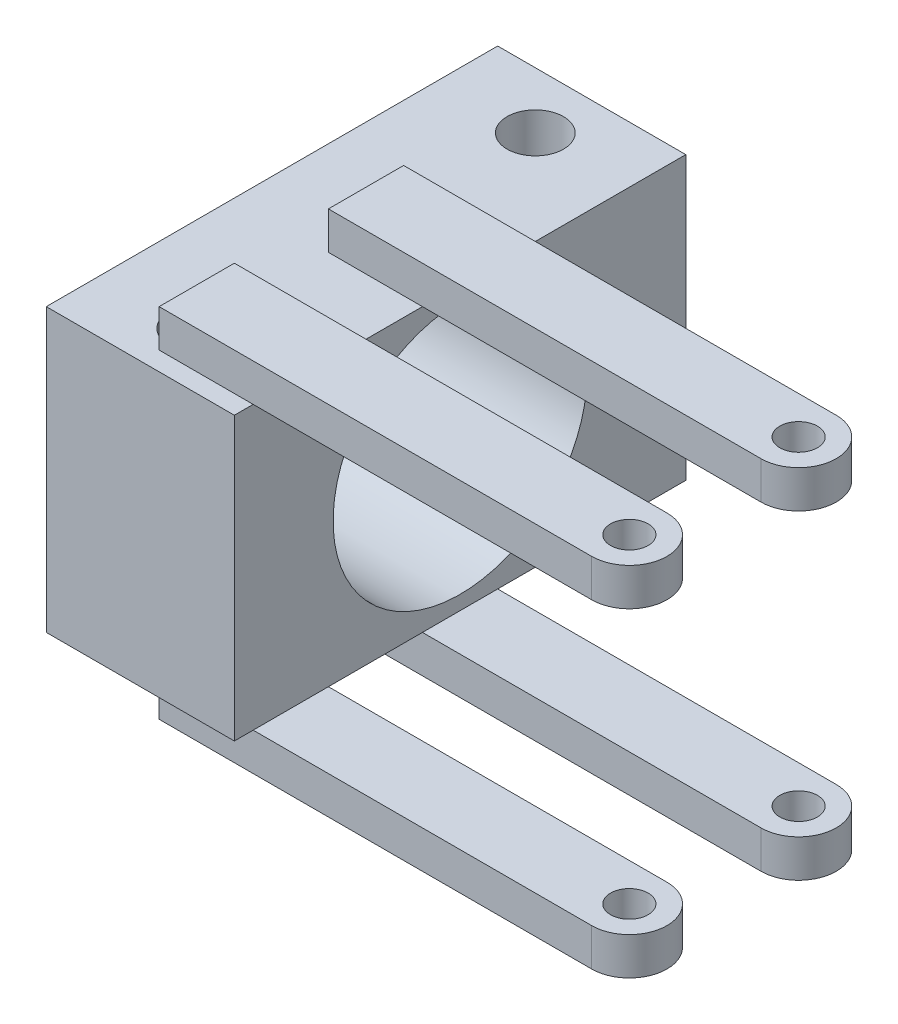
ISO-10303-21;
HEADER;
FILE_DESCRIPTION(('STEP AP214'),'2;1');
FILE_NAME('part.step','',(''),(''),'','','');
FILE_SCHEMA(('AUTOMOTIVE_DESIGN { 1 0 10303 214 1 1 1 1 }'));
ENDSEC;
DATA;
#1=APPLICATION_CONTEXT('core data for automotive mechanical design processes');
#2=APPLICATION_PROTOCOL_DEFINITION('international standard','automotive_design',2000,#1);
#3=PRODUCT_CONTEXT('',#1,'mechanical');
#4=PRODUCT('Part','Part','',(#3));
#5=PRODUCT_RELATED_PRODUCT_CATEGORY('part','',(#4));
#6=PRODUCT_DEFINITION_FORMATION('','',#4);
#7=PRODUCT_DEFINITION_CONTEXT('part definition',#1,'design');
#8=PRODUCT_DEFINITION('design','',#6,#7);
#9=PRODUCT_DEFINITION_SHAPE('','',#8);
#10=(LENGTH_UNIT() NAMED_UNIT(*) SI_UNIT(.MILLI.,.METRE.));
#11=(NAMED_UNIT(*) PLANE_ANGLE_UNIT() SI_UNIT($,.RADIAN.));
#12=(NAMED_UNIT(*) SI_UNIT($,.STERADIAN.) SOLID_ANGLE_UNIT());
#13=UNCERTAINTY_MEASURE_WITH_UNIT(LENGTH_MEASURE(1.E-05),#10,'distance_accuracy_value','');
#14=(GEOMETRIC_REPRESENTATION_CONTEXT(3) GLOBAL_UNCERTAINTY_ASSIGNED_CONTEXT((#13)) GLOBAL_UNIT_ASSIGNED_CONTEXT((#10,
#11,#12)) REPRESENTATION_CONTEXT('',''));
#15=CARTESIAN_POINT('',(0.,0.,0.));
#16=DIRECTION('',(0.,0.,1.));
#17=DIRECTION('',(1.,0.,0.));
#18=AXIS2_PLACEMENT_3D('',#15,#16,#17);
#19=CARTESIAN_POINT('',(0.,15.,0.));
#20=DIRECTION('',(0.,-1.,0.));
#21=DIRECTION('',(0.,0.,-1.));
#22=AXIS2_PLACEMENT_3D('',#19,#20,#21);
#23=PLANE('',#22);
#24=CARTESIAN_POINT('',(0.,15.,-9.));
#25=DIRECTION('',(0.,1.,0.));
#26=DIRECTION('',(0.,0.,1.));
#27=AXIS2_PLACEMENT_3D('',#24,#25,#26);
#28=CIRCLE('',#27,1.5);
#29=CARTESIAN_POINT('',(0.,15.,-7.5));
#30=VERTEX_POINT('',#29);
#31=EDGE_CURVE('E394',#30,#30,#28,.T.);
#32=ORIENTED_EDGE('',*,*,#31,.F.);
#33=EDGE_LOOP('',(#32));
#34=FACE_BOUND('',#33,.T.);
#35=DIRECTION('',(-1.,0.,0.));
#36=VECTOR('',#35,1.);
#37=CARTESIAN_POINT('',(0.,15.,7.));
#38=LINE('',#37,#36);
#39=CARTESIAN_POINT('',(5.,15.,7.));
#40=VERTEX_POINT('',#39);
#41=CARTESIAN_POINT('',(0.,15.,7.));
#42=VERTEX_POINT('',#41);
#43=EDGE_CURVE('E477',#40,#42,#38,.T.);
#44=ORIENTED_EDGE('',*,*,#43,.F.);
#45=DIRECTION('',(0.,0.,-1.));
#46=VECTOR('',#45,1.);
#47=CARTESIAN_POINT('',(5.,15.,12.));
#48=LINE('',#47,#46);
#49=CARTESIAN_POINT('',(5.,15.,2.));
#50=VERTEX_POINT('',#49);
#51=EDGE_CURVE('E404',#40,#50,#48,.T.);
#52=ORIENTED_EDGE('',*,*,#51,.T.);
#53=DIRECTION('',(-1.,0.,0.));
#54=VECTOR('',#53,1.);
#55=CARTESIAN_POINT('',(0.,15.,2.));
#56=LINE('',#55,#54);
#57=CARTESIAN_POINT('',(0.,15.,2.));
#58=VERTEX_POINT('',#57);
#59=EDGE_CURVE('E11',#50,#58,#56,.T.);
#60=ORIENTED_EDGE('',*,*,#59,.T.);
#61=DIRECTION('',(0.,0.,-1.));
#62=VECTOR('',#61,1.);
#63=CARTESIAN_POINT('',(0.,15.,0.));
#64=LINE('',#63,#62);
#65=CARTESIAN_POINT('',(0.,15.,-2.));
#66=VERTEX_POINT('',#65);
#67=EDGE_CURVE('E304',#58,#66,#64,.T.);
#68=ORIENTED_EDGE('',*,*,#67,.T.);
#69=DIRECTION('',(1.,0.,0.));
#70=VECTOR('',#69,1.);
#71=CARTESIAN_POINT('',(23.,15.,-2.));
#72=LINE('',#71,#70);
#73=CARTESIAN_POINT('',(5.,15.,-2.));
#74=VERTEX_POINT('',#73);
#75=EDGE_CURVE('E311',#66,#74,#72,.T.);
#76=ORIENTED_EDGE('',*,*,#75,.T.);
#77=CARTESIAN_POINT('',(5.,15.,-12.));
#78=VERTEX_POINT('',#77);
#79=EDGE_CURVE('E423',#74,#78,#48,.T.);
#80=ORIENTED_EDGE('',*,*,#79,.T.);
#81=DIRECTION('',(-1.,0.,0.));
#82=VECTOR('',#81,1.);
#83=CARTESIAN_POINT('',(-5.,15.,-12.));
#84=LINE('',#83,#82);
#85=CARTESIAN_POINT('',(-5.,15.,-12.));
#86=VERTEX_POINT('',#85);
#87=EDGE_CURVE('E403',#78,#86,#84,.T.);
#88=ORIENTED_EDGE('',*,*,#87,.T.);
#89=DIRECTION('',(0.,0.,1.));
#90=VECTOR('',#89,1.);
#91=CARTESIAN_POINT('',(-5.,15.,12.));
#92=LINE('',#91,#90);
#93=CARTESIAN_POINT('',(-5.,15.,12.));
#94=VERTEX_POINT('',#93);
#95=EDGE_CURVE('E407',#86,#94,#92,.T.);
#96=ORIENTED_EDGE('',*,*,#95,.T.);
#97=DIRECTION('',(1.,0.,0.));
#98=VECTOR('',#97,1.);
#99=CARTESIAN_POINT('',(-5.,15.,12.));
#100=LINE('',#99,#98);
#101=CARTESIAN_POINT('',(5.,15.,12.));
#102=VERTEX_POINT('',#101);
#103=EDGE_CURVE('E409',#94,#102,#100,.T.);
#104=ORIENTED_EDGE('',*,*,#103,.T.);
#105=CARTESIAN_POINT('',(5.,15.,11.));
#106=VERTEX_POINT('',#105);
#107=EDGE_CURVE('E400',#102,#106,#48,.T.);
#108=ORIENTED_EDGE('',*,*,#107,.T.);
#109=DIRECTION('',(1.,0.,0.));
#110=VECTOR('',#109,1.);
#111=CARTESIAN_POINT('',(23.,15.,11.));
#112=LINE('',#111,#110);
#113=CARTESIAN_POINT('',(0.,15.,11.));
#114=VERTEX_POINT('',#113);
#115=EDGE_CURVE('E785',#114,#106,#112,.T.);
#116=ORIENTED_EDGE('',*,*,#115,.F.);
#117=DIRECTION('',(0.,0.,1.));
#118=VECTOR('',#117,1.);
#119=CARTESIAN_POINT('',(0.,15.,9.));
#120=LINE('',#119,#118);
#121=CARTESIAN_POINT('',(0.,15.,10.5));
#122=VERTEX_POINT('',#121);
#123=EDGE_CURVE('E247',#122,#114,#120,.T.);
#124=ORIENTED_EDGE('',*,*,#123,.F.);
#125=CARTESIAN_POINT('',(0.,15.,9.));
#126=DIRECTION('',(0.,1.,0.));
#127=DIRECTION('',(0.,0.,-1.));
#128=AXIS2_PLACEMENT_3D('',#125,#126,#127);
#129=CIRCLE('',#128,1.5);
#130=CARTESIAN_POINT('',(0.,15.,7.5));
#131=VERTEX_POINT('',#130);
#132=EDGE_CURVE('E386',#131,#122,#129,.T.);
#133=ORIENTED_EDGE('',*,*,#132,.F.);
#134=EDGE_CURVE('E63',#42,#131,#120,.T.);
#135=ORIENTED_EDGE('',*,*,#134,.F.);
#136=EDGE_LOOP('',(#44,#52,#60,#68,#76,#80,#88,#96,#104,#108,#116,#124,#133,#135));
#137=FACE_BOUND('',#136,.T.);
#138=ADVANCED_FACE('F45',(#34,#137),#23,.F.);
#139=CARTESIAN_POINT('',(0.,0.,0.));
#140=DIRECTION('',(0.,-1.,0.));
#141=DIRECTION('',(0.,0.,-1.));
#142=AXIS2_PLACEMENT_3D('',#139,#140,#141);
#143=PLANE('',#142);
#144=DIRECTION('',(0.,0.,1.));
#145=VECTOR('',#144,1.);
#146=CARTESIAN_POINT('',(0.,0.,9.));
#147=LINE('',#146,#145);
#148=CARTESIAN_POINT('',(0.,0.,7.));
#149=VERTEX_POINT('',#148);
#150=CARTESIAN_POINT('',(0.,0.,7.5));
#151=VERTEX_POINT('',#150);
#152=EDGE_CURVE('E277',#149,#151,#147,.T.);
#153=ORIENTED_EDGE('',*,*,#152,.T.);
#154=CARTESIAN_POINT('',(0.,0.,9.));
#155=DIRECTION('',(0.,1.,0.));
#156=DIRECTION('',(0.,0.,-1.));
#157=AXIS2_PLACEMENT_3D('',#154,#155,#156);
#158=CIRCLE('',#157,1.5);
#159=CARTESIAN_POINT('',(0.,0.,10.5));
#160=VERTEX_POINT('',#159);
#161=EDGE_CURVE('E391',#151,#160,#158,.T.);
#162=ORIENTED_EDGE('',*,*,#161,.T.);
#163=CARTESIAN_POINT('',(0.,0.,11.));
#164=VERTEX_POINT('',#163);
#165=EDGE_CURVE('E260',#160,#164,#147,.T.);
#166=ORIENTED_EDGE('',*,*,#165,.T.);
#167=DIRECTION('',(1.,0.,0.));
#168=VECTOR('',#167,1.);
#169=CARTESIAN_POINT('',(23.,0.,11.));
#170=LINE('',#169,#168);
#171=CARTESIAN_POINT('',(5.,0.,11.));
#172=VERTEX_POINT('',#171);
#173=EDGE_CURVE('E267',#164,#172,#170,.T.);
#174=ORIENTED_EDGE('',*,*,#173,.T.);
#175=DIRECTION('',(0.,0.,-1.));
#176=VECTOR('',#175,1.);
#177=CARTESIAN_POINT('',(5.,0.,12.));
#178=LINE('',#177,#176);
#179=CARTESIAN_POINT('',(5.,0.,12.));
#180=VERTEX_POINT('',#179);
#181=EDGE_CURVE('E412',#180,#172,#178,.T.);
#182=ORIENTED_EDGE('',*,*,#181,.F.);
#183=DIRECTION('',(1.,0.,0.));
#184=VECTOR('',#183,1.);
#185=CARTESIAN_POINT('',(-5.,0.,12.));
#186=LINE('',#185,#184);
#187=CARTESIAN_POINT('',(-5.,0.,12.));
#188=VERTEX_POINT('',#187);
#189=EDGE_CURVE('E421',#188,#180,#186,.T.);
#190=ORIENTED_EDGE('',*,*,#189,.F.);
#191=DIRECTION('',(0.,0.,1.));
#192=VECTOR('',#191,1.);
#193=CARTESIAN_POINT('',(-5.,0.,12.));
#194=LINE('',#193,#192);
#195=CARTESIAN_POINT('',(-5.,0.,-12.));
#196=VERTEX_POINT('',#195);
#197=EDGE_CURVE('E419',#196,#188,#194,.T.);
#198=ORIENTED_EDGE('',*,*,#197,.F.);
#199=DIRECTION('',(-1.,0.,0.));
#200=VECTOR('',#199,1.);
#201=CARTESIAN_POINT('',(-5.,0.,-12.));
#202=LINE('',#201,#200);
#203=CARTESIAN_POINT('',(5.,0.,-12.));
#204=VERTEX_POINT('',#203);
#205=EDGE_CURVE('E415',#204,#196,#202,.T.);
#206=ORIENTED_EDGE('',*,*,#205,.F.);
#207=CARTESIAN_POINT('',(5.,0.,-2.));
#208=VERTEX_POINT('',#207);
#209=EDGE_CURVE('E397',#208,#204,#178,.T.);
#210=ORIENTED_EDGE('',*,*,#209,.F.);
#211=DIRECTION('',(1.,0.,0.));
#212=VECTOR('',#211,1.);
#213=CARTESIAN_POINT('',(23.,0.,-2.));
#214=LINE('',#213,#212);
#215=CARTESIAN_POINT('',(0.,0.,-2.));
#216=VERTEX_POINT('',#215);
#217=EDGE_CURVE('E358',#216,#208,#214,.T.);
#218=ORIENTED_EDGE('',*,*,#217,.F.);
#219=DIRECTION('',(0.,0.,-1.));
#220=VECTOR('',#219,1.);
#221=CARTESIAN_POINT('',(0.,0.,0.));
#222=LINE('',#221,#220);
#223=CARTESIAN_POINT('',(0.,0.,2.));
#224=VERTEX_POINT('',#223);
#225=EDGE_CURVE('E350',#224,#216,#222,.T.);
#226=ORIENTED_EDGE('',*,*,#225,.F.);
#227=DIRECTION('',(-1.,0.,0.));
#228=VECTOR('',#227,1.);
#229=CARTESIAN_POINT('',(0.,0.,2.));
#230=LINE('',#229,#228);
#231=CARTESIAN_POINT('',(5.,0.,2.));
#232=VERTEX_POINT('',#231);
#233=EDGE_CURVE('E54',#232,#224,#230,.T.);
#234=ORIENTED_EDGE('',*,*,#233,.F.);
#235=CARTESIAN_POINT('',(5.,0.,7.));
#236=VERTEX_POINT('',#235);
#237=EDGE_CURVE('E416',#236,#232,#178,.T.);
#238=ORIENTED_EDGE('',*,*,#237,.F.);
#239=DIRECTION('',(-1.,0.,0.));
#240=VECTOR('',#239,1.);
#241=CARTESIAN_POINT('',(0.,0.,7.));
#242=LINE('',#241,#240);
#243=EDGE_CURVE('E71',#236,#149,#242,.T.);
#244=ORIENTED_EDGE('',*,*,#243,.T.);
#245=EDGE_LOOP('',(#153,#162,#166,#174,#182,#190,#198,#206,#210,#218,#226,#234,#238,#244));
#246=FACE_BOUND('',#245,.T.);
#247=CARTESIAN_POINT('',(0.,0.,-9.));
#248=DIRECTION('',(0.,1.,0.));
#249=DIRECTION('',(0.,0.,1.));
#250=AXIS2_PLACEMENT_3D('',#247,#248,#249);
#251=CIRCLE('',#250,1.5);
#252=CARTESIAN_POINT('',(0.,0.,-7.5));
#253=VERTEX_POINT('',#252);
#254=EDGE_CURVE('E389',#253,#253,#251,.T.);
#255=ORIENTED_EDGE('',*,*,#254,.T.);
#256=EDGE_LOOP('',(#255));
#257=FACE_BOUND('',#256,.T.);
#258=ADVANCED_FACE('F463',(#246,#257),#143,.T.);
#259=CARTESIAN_POINT('',(5.,15.,12.));
#260=DIRECTION('',(-1.,0.,0.));
#261=DIRECTION('',(0.,0.,1.));
#262=AXIS2_PLACEMENT_3D('',#259,#260,#261);
#263=PLANE('',#262);
#264=CARTESIAN_POINT('',(5.,7.5,0.));
#265=DIRECTION('',(1.,0.,0.));
#266=DIRECTION('',(0.,0.,-1.));
#267=AXIS2_PLACEMENT_3D('',#264,#265,#266);
#268=CIRCLE('',#267,6.75);
#269=CARTESIAN_POINT('',(5.,7.5,-6.75));
#270=VERTEX_POINT('',#269);
#271=EDGE_CURVE('E379',#270,#270,#268,.T.);
#272=ORIENTED_EDGE('',*,*,#271,.F.);
#273=EDGE_LOOP('',(#272));
#274=FACE_BOUND('',#273,.T.);
#275=ORIENTED_EDGE('',*,*,#181,.T.);
#276=DIRECTION('',(0.,0.,-1.));
#277=VECTOR('',#276,1.);
#278=CARTESIAN_POINT('',(5.,0.,12.));
#279=LINE('',#278,#277);
#280=EDGE_CURVE('E297',#172,#236,#279,.T.);
#281=ORIENTED_EDGE('',*,*,#280,.T.);
#282=ORIENTED_EDGE('',*,*,#237,.T.);
#283=EDGE_CURVE('E417',#232,#208,#178,.T.);
#284=ORIENTED_EDGE('',*,*,#283,.T.);
#285=ORIENTED_EDGE('',*,*,#209,.T.);
#286=DIRECTION('',(0.,-1.,0.));
#287=VECTOR('',#286,1.);
#288=CARTESIAN_POINT('',(5.,15.,-12.));
#289=LINE('',#288,#287);
#290=EDGE_CURVE('E49',#78,#204,#289,.T.);
#291=ORIENTED_EDGE('',*,*,#290,.F.);
#292=ORIENTED_EDGE('',*,*,#79,.F.);
#293=EDGE_CURVE('E405',#50,#74,#48,.T.);
#294=ORIENTED_EDGE('',*,*,#293,.F.);
#295=ORIENTED_EDGE('',*,*,#51,.F.);
#296=DIRECTION('',(0.,0.,1.));
#297=VECTOR('',#296,1.);
#298=CARTESIAN_POINT('',(5.,15.,12.));
#299=LINE('',#298,#297);
#300=EDGE_CURVE('E248',#40,#106,#299,.T.);
#301=ORIENTED_EDGE('',*,*,#300,.T.);
#302=ORIENTED_EDGE('',*,*,#107,.F.);
#303=DIRECTION('',(0.,-1.,0.));
#304=VECTOR('',#303,1.);
#305=CARTESIAN_POINT('',(5.,15.,12.));
#306=LINE('',#305,#304);
#307=EDGE_CURVE('E411',#102,#180,#306,.T.);
#308=ORIENTED_EDGE('',*,*,#307,.T.);
#309=EDGE_LOOP('',(#275,#281,#282,#284,#285,#291,#292,#294,#295,#301,#302,#308));
#310=FACE_BOUND('',#309,.T.);
#311=ADVANCED_FACE('F47',(#274,#310),#263,.F.);
#312=CARTESIAN_POINT('',(-5.,15.,-12.));
#313=DIRECTION('',(0.,0.,1.));
#314=DIRECTION('',(1.,0.,0.));
#315=AXIS2_PLACEMENT_3D('',#312,#313,#314);
#316=PLANE('',#315);
#317=ORIENTED_EDGE('',*,*,#205,.T.);
#318=DIRECTION('',(0.,-1.,0.));
#319=VECTOR('',#318,1.);
#320=CARTESIAN_POINT('',(-5.,15.,-12.));
#321=LINE('',#320,#319);
#322=EDGE_CURVE('E428',#86,#196,#321,.T.);
#323=ORIENTED_EDGE('',*,*,#322,.F.);
#324=ORIENTED_EDGE('',*,*,#87,.F.);
#325=ORIENTED_EDGE('',*,*,#290,.T.);
#326=EDGE_LOOP('',(#317,#323,#324,#325));
#327=FACE_BOUND('',#326,.T.);
#328=ADVANCED_FACE('F466',(#327),#316,.F.);
#329=CARTESIAN_POINT('',(-5.,15.,12.));
#330=DIRECTION('',(1.,0.,0.));
#331=DIRECTION('',(0.,0.,-1.));
#332=AXIS2_PLACEMENT_3D('',#329,#330,#331);
#333=PLANE('',#332);
#334=CARTESIAN_POINT('',(-5.,7.5,0.));
#335=DIRECTION('',(1.,0.,0.));
#336=DIRECTION('',(0.,0.,-1.));
#337=AXIS2_PLACEMENT_3D('',#334,#335,#336);
#338=CIRCLE('',#337,6.75);
#339=CARTESIAN_POINT('',(-5.,7.5,-6.75));
#340=VERTEX_POINT('',#339);
#341=EDGE_CURVE('E382',#340,#340,#338,.F.);
#342=ORIENTED_EDGE('',*,*,#341,.F.);
#343=EDGE_LOOP('',(#342));
#344=FACE_BOUND('',#343,.T.);
#345=ORIENTED_EDGE('',*,*,#197,.T.);
#346=DIRECTION('',(0.,-1.,0.));
#347=VECTOR('',#346,1.);
#348=CARTESIAN_POINT('',(-5.,15.,12.));
#349=LINE('',#348,#347);
#350=EDGE_CURVE('E426',#94,#188,#349,.T.);
#351=ORIENTED_EDGE('',*,*,#350,.F.);
#352=ORIENTED_EDGE('',*,*,#95,.F.);
#353=ORIENTED_EDGE('',*,*,#322,.T.);
#354=EDGE_LOOP('',(#345,#351,#352,#353));
#355=FACE_BOUND('',#354,.T.);
#356=ADVANCED_FACE('F468',(#344,#355),#333,.F.);
#357=CARTESIAN_POINT('',(-5.,15.,12.));
#358=DIRECTION('',(0.,0.,-1.));
#359=DIRECTION('',(-1.,0.,0.));
#360=AXIS2_PLACEMENT_3D('',#357,#358,#359);
#361=PLANE('',#360);
#362=ORIENTED_EDGE('',*,*,#189,.T.);
#363=ORIENTED_EDGE('',*,*,#307,.F.);
#364=ORIENTED_EDGE('',*,*,#103,.F.);
#365=ORIENTED_EDGE('',*,*,#350,.T.);
#366=EDGE_LOOP('',(#362,#363,#364,#365));
#367=FACE_BOUND('',#366,.T.);
#368=ADVANCED_FACE('F520',(#367),#361,.F.);
#369=CARTESIAN_POINT('',(0.,15.,-9.));
#370=DIRECTION('',(0.,-1.,0.));
#371=DIRECTION('',(0.,0.,-1.));
#372=AXIS2_PLACEMENT_3D('',#369,#370,#371);
#373=CYLINDRICAL_SURFACE('',#372,1.5);
#374=ORIENTED_EDGE('',*,*,#31,.T.);
#375=EDGE_LOOP('',(#374));
#376=FACE_BOUND('',#375,.T.);
#377=ORIENTED_EDGE('',*,*,#254,.F.);
#378=EDGE_LOOP('',(#377));
#379=FACE_BOUND('',#378,.T.);
#380=ADVANCED_FACE('F517',(#376,#379),#373,.F.);
#381=CARTESIAN_POINT('',(0.,15.,9.));
#382=DIRECTION('',(0.,-1.,0.));
#383=DIRECTION('',(0.,0.,-1.));
#384=AXIS2_PLACEMENT_3D('',#381,#382,#383);
#385=CYLINDRICAL_SURFACE('',#384,1.5);
#386=ORIENTED_EDGE('',*,*,#132,.T.);
#387=EDGE_CURVE('E390',#122,#131,#129,.T.);
#388=ORIENTED_EDGE('',*,*,#387,.T.);
#389=EDGE_LOOP('',(#386,#388));
#390=FACE_BOUND('',#389,.T.);
#391=ORIENTED_EDGE('',*,*,#161,.F.);
#392=EDGE_CURVE('E385',#160,#151,#158,.T.);
#393=ORIENTED_EDGE('',*,*,#392,.F.);
#394=EDGE_LOOP('',(#391,#393));
#395=FACE_BOUND('',#394,.T.);
#396=ADVANCED_FACE('F538',(#390,#395),#385,.F.);
#397=CARTESIAN_POINT('',(-24.0918830920368,7.5,0.));
#398=DIRECTION('',(1.,0.,0.));
#399=DIRECTION('',(0.,0.,-1.));
#400=AXIS2_PLACEMENT_3D('',#397,#398,#399);
#401=CYLINDRICAL_SURFACE('',#400,6.75);
#402=ORIENTED_EDGE('',*,*,#341,.T.);
#403=EDGE_LOOP('',(#402));
#404=FACE_BOUND('',#403,.T.);
#405=ORIENTED_EDGE('',*,*,#271,.T.);
#406=EDGE_LOOP('',(#405));
#407=FACE_BOUND('',#406,.T.);
#408=ADVANCED_FACE('F536',(#404,#407),#401,.F.);
#409=CARTESIAN_POINT('',(23.,0.,0.));
#410=DIRECTION('',(0.,1.,0.));
#411=DIRECTION('',(0.,0.,1.));
#412=AXIS2_PLACEMENT_3D('',#409,#410,#411);
#413=PLANE('',#412);
#414=CARTESIAN_POINT('',(23.,0.,0.));
#415=DIRECTION('',(0.,-1.,0.));
#416=DIRECTION('',(0.,0.,-1.));
#417=AXIS2_PLACEMENT_3D('',#414,#415,#416);
#418=CIRCLE('',#417,1.);
#419=CARTESIAN_POINT('',(23.,0.,-1.));
#420=VERTEX_POINT('',#419);
#421=EDGE_CURVE('E339',#420,#420,#418,.T.);
#422=ORIENTED_EDGE('',*,*,#421,.T.);
#423=EDGE_LOOP('',(#422));
#424=FACE_BOUND('',#423,.T.);
#425=ORIENTED_EDGE('',*,*,#283,.F.);
#426=CARTESIAN_POINT('',(23.,0.,2.));
#427=VERTEX_POINT('',#426);
#428=EDGE_CURVE('E363',#427,#232,#230,.T.);
#429=ORIENTED_EDGE('',*,*,#428,.F.);
#430=CARTESIAN_POINT('',(23.,0.,0.));
#431=DIRECTION('',(0.,-1.,0.));
#432=DIRECTION('',(0.,0.,1.));
#433=AXIS2_PLACEMENT_3D('',#430,#431,#432);
#434=CIRCLE('',#433,2.);
#435=CARTESIAN_POINT('',(23.,0.,-2.));
#436=VERTEX_POINT('',#435);
#437=EDGE_CURVE('E361',#436,#427,#434,.T.);
#438=ORIENTED_EDGE('',*,*,#437,.F.);
#439=EDGE_CURVE('E343',#208,#436,#214,.T.);
#440=ORIENTED_EDGE('',*,*,#439,.F.);
#441=EDGE_LOOP('',(#425,#429,#438,#440));
#442=FACE_BOUND('',#441,.T.);
#443=ADVANCED_FACE('F457',(#424,#442),#413,.T.);
#444=CARTESIAN_POINT('',(23.,-2.,0.));
#445=DIRECTION('',(0.,1.,0.));
#446=DIRECTION('',(0.,0.,1.));
#447=AXIS2_PLACEMENT_3D('',#444,#445,#446);
#448=PLANE('',#447);
#449=DIRECTION('',(0.,0.,-1.));
#450=VECTOR('',#449,1.);
#451=CARTESIAN_POINT('',(0.,-2.,-2.));
#452=LINE('',#451,#450);
#453=CARTESIAN_POINT('',(0.,-2.,2.));
#454=VERTEX_POINT('',#453);
#455=CARTESIAN_POINT('',(0.,-2.,-2.));
#456=VERTEX_POINT('',#455);
#457=EDGE_CURVE('E346',#454,#456,#452,.T.);
#458=ORIENTED_EDGE('',*,*,#457,.T.);
#459=DIRECTION('',(1.,0.,0.));
#460=VECTOR('',#459,1.);
#461=CARTESIAN_POINT('',(23.,-2.,-2.));
#462=LINE('',#461,#460);
#463=CARTESIAN_POINT('',(23.,-2.,-2.));
#464=VERTEX_POINT('',#463);
#465=EDGE_CURVE('E349',#456,#464,#462,.T.);
#466=ORIENTED_EDGE('',*,*,#465,.T.);
#467=CARTESIAN_POINT('',(23.,-2.,0.));
#468=DIRECTION('',(0.,-1.,0.));
#469=DIRECTION('',(0.,0.,1.));
#470=AXIS2_PLACEMENT_3D('',#467,#468,#469);
#471=CIRCLE('',#470,2.);
#472=CARTESIAN_POINT('',(23.,-2.,2.));
#473=VERTEX_POINT('',#472);
#474=EDGE_CURVE('E352',#464,#473,#471,.T.);
#475=ORIENTED_EDGE('',*,*,#474,.T.);
#476=DIRECTION('',(-1.,0.,0.));
#477=VECTOR('',#476,1.);
#478=CARTESIAN_POINT('',(0.,-2.,2.));
#479=LINE('',#478,#477);
#480=EDGE_CURVE('E354',#473,#454,#479,.T.);
#481=ORIENTED_EDGE('',*,*,#480,.T.);
#482=EDGE_LOOP('',(#458,#466,#475,#481));
#483=FACE_BOUND('',#482,.T.);
#484=CARTESIAN_POINT('',(23.,-2.,0.));
#485=DIRECTION('',(0.,-1.,0.));
#486=DIRECTION('',(0.,0.,-1.));
#487=AXIS2_PLACEMENT_3D('',#484,#485,#486);
#488=CIRCLE('',#487,1.);
#489=CARTESIAN_POINT('',(23.,-2.,-1.));
#490=VERTEX_POINT('',#489);
#491=EDGE_CURVE('E340',#490,#490,#488,.T.);
#492=ORIENTED_EDGE('',*,*,#491,.F.);
#493=EDGE_LOOP('',(#492));
#494=FACE_BOUND('',#493,.T.);
#495=ADVANCED_FACE('F450',(#483,#494),#448,.F.);
#496=CARTESIAN_POINT('',(23.,-2.,-2.));
#497=DIRECTION('',(0.,0.,1.));
#498=DIRECTION('',(1.,0.,0.));
#499=AXIS2_PLACEMENT_3D('',#496,#497,#498);
#500=PLANE('',#499);
#501=ORIENTED_EDGE('',*,*,#217,.T.);
#502=ORIENTED_EDGE('',*,*,#439,.T.);
#503=DIRECTION('',(0.,1.,0.));
#504=VECTOR('',#503,1.);
#505=CARTESIAN_POINT('',(23.,-2.,-2.));
#506=LINE('',#505,#504);
#507=EDGE_CURVE('E373',#464,#436,#506,.T.);
#508=ORIENTED_EDGE('',*,*,#507,.F.);
#509=ORIENTED_EDGE('',*,*,#465,.F.);
#510=DIRECTION('',(0.,1.,0.));
#511=VECTOR('',#510,1.);
#512=CARTESIAN_POINT('',(0.,-2.,-2.));
#513=LINE('',#512,#511);
#514=EDGE_CURVE('E376',#456,#216,#513,.T.);
#515=ORIENTED_EDGE('',*,*,#514,.T.);
#516=EDGE_LOOP('',(#501,#502,#508,#509,#515));
#517=FACE_BOUND('',#516,.T.);
#518=ADVANCED_FACE('F548',(#517),#500,.F.);
#519=CARTESIAN_POINT('',(23.,-2.,0.));
#520=DIRECTION('',(0.,1.,0.));
#521=DIRECTION('',(0.,0.,1.));
#522=AXIS2_PLACEMENT_3D('',#519,#520,#521);
#523=CYLINDRICAL_SURFACE('',#522,2.);
#524=ORIENTED_EDGE('',*,*,#437,.T.);
#525=DIRECTION('',(0.,1.,0.));
#526=VECTOR('',#525,1.);
#527=CARTESIAN_POINT('',(23.,-2.,2.));
#528=LINE('',#527,#526);
#529=EDGE_CURVE('E370',#473,#427,#528,.T.);
#530=ORIENTED_EDGE('',*,*,#529,.F.);
#531=ORIENTED_EDGE('',*,*,#474,.F.);
#532=ORIENTED_EDGE('',*,*,#507,.T.);
#533=EDGE_LOOP('',(#524,#530,#531,#532));
#534=FACE_BOUND('',#533,.T.);
#535=ADVANCED_FACE('F551',(#534),#523,.T.);
#536=CARTESIAN_POINT('',(0.,-2.,2.));
#537=DIRECTION('',(0.,0.,-1.));
#538=DIRECTION('',(-1.,0.,0.));
#539=AXIS2_PLACEMENT_3D('',#536,#537,#538);
#540=PLANE('',#539);
#541=ORIENTED_EDGE('',*,*,#428,.T.);
#542=ORIENTED_EDGE('',*,*,#233,.T.);
#543=DIRECTION('',(0.,1.,0.));
#544=VECTOR('',#543,1.);
#545=CARTESIAN_POINT('',(0.,-2.,2.));
#546=LINE('',#545,#544);
#547=EDGE_CURVE('E357',#454,#224,#546,.T.);
#548=ORIENTED_EDGE('',*,*,#547,.F.);
#549=ORIENTED_EDGE('',*,*,#480,.F.);
#550=ORIENTED_EDGE('',*,*,#529,.T.);
#551=EDGE_LOOP('',(#541,#542,#548,#549,#550));
#552=FACE_BOUND('',#551,.T.);
#553=ADVANCED_FACE('F442',(#552),#540,.F.);
#554=CARTESIAN_POINT('',(0.,-2.,0.));
#555=DIRECTION('',(1.,0.,0.));
#556=DIRECTION('',(0.,0.,-1.));
#557=AXIS2_PLACEMENT_3D('',#554,#555,#556);
#558=PLANE('',#557);
#559=ORIENTED_EDGE('',*,*,#225,.T.);
#560=ORIENTED_EDGE('',*,*,#514,.F.);
#561=ORIENTED_EDGE('',*,*,#457,.F.);
#562=ORIENTED_EDGE('',*,*,#547,.T.);
#563=EDGE_LOOP('',(#559,#560,#561,#562));
#564=FACE_BOUND('',#563,.T.);
#565=ADVANCED_FACE('F447',(#564),#558,.F.);
#566=CARTESIAN_POINT('',(23.,-2.,0.));
#567=DIRECTION('',(0.,1.,0.));
#568=DIRECTION('',(0.,0.,1.));
#569=AXIS2_PLACEMENT_3D('',#566,#567,#568);
#570=CYLINDRICAL_SURFACE('',#569,1.);
#571=ORIENTED_EDGE('',*,*,#491,.T.);
#572=EDGE_LOOP('',(#571));
#573=FACE_BOUND('',#572,.T.);
#574=ORIENTED_EDGE('',*,*,#421,.F.);
#575=EDGE_LOOP('',(#574));
#576=FACE_BOUND('',#575,.T.);
#577=ADVANCED_FACE('F558',(#573,#576),#570,.F.);
#578=CARTESIAN_POINT('',(0.,17.,0.));
#579=DIRECTION('',(-1.,0.,0.));
#580=DIRECTION('',(0.,0.,1.));
#581=AXIS2_PLACEMENT_3D('',#578,#579,#580);
#582=PLANE('',#581);
#583=ORIENTED_EDGE('',*,*,#67,.F.);
#584=DIRECTION('',(0.,-1.,0.));
#585=VECTOR('',#584,1.);
#586=CARTESIAN_POINT('',(0.,17.,2.));
#587=LINE('',#586,#585);
#588=CARTESIAN_POINT('',(0.,17.,2.));
#589=VERTEX_POINT('',#588);
#590=EDGE_CURVE('E336',#589,#58,#587,.T.);
#591=ORIENTED_EDGE('',*,*,#590,.F.);
#592=DIRECTION('',(0.,0.,-1.));
#593=VECTOR('',#592,1.);
#594=CARTESIAN_POINT('',(0.,17.,-2.));
#595=LINE('',#594,#593);
#596=CARTESIAN_POINT('',(0.,17.,-2.));
#597=VERTEX_POINT('',#596);
#598=EDGE_CURVE('E307',#589,#597,#595,.T.);
#599=ORIENTED_EDGE('',*,*,#598,.T.);
#600=DIRECTION('',(0.,-1.,0.));
#601=VECTOR('',#600,1.);
#602=CARTESIAN_POINT('',(0.,17.,-2.));
#603=LINE('',#602,#601);
#604=EDGE_CURVE('E320',#597,#66,#603,.T.);
#605=ORIENTED_EDGE('',*,*,#604,.T.);
#606=EDGE_LOOP('',(#583,#591,#599,#605));
#607=FACE_BOUND('',#606,.T.);
#608=ADVANCED_FACE('F494',(#607),#582,.T.);
#609=CARTESIAN_POINT('',(0.,17.,2.));
#610=DIRECTION('',(0.,0.,1.));
#611=DIRECTION('',(1.,0.,0.));
#612=AXIS2_PLACEMENT_3D('',#609,#610,#611);
#613=PLANE('',#612);
#614=CARTESIAN_POINT('',(23.,15.,2.));
#615=VERTEX_POINT('',#614);
#616=EDGE_CURVE('E56',#615,#50,#56,.T.);
#617=ORIENTED_EDGE('',*,*,#616,.F.);
#618=DIRECTION('',(0.,-1.,0.));
#619=VECTOR('',#618,1.);
#620=CARTESIAN_POINT('',(23.,17.,2.));
#621=LINE('',#620,#619);
#622=CARTESIAN_POINT('',(23.,17.,2.));
#623=VERTEX_POINT('',#622);
#624=EDGE_CURVE('E334',#623,#615,#621,.T.);
#625=ORIENTED_EDGE('',*,*,#624,.F.);
#626=DIRECTION('',(-1.,0.,0.));
#627=VECTOR('',#626,1.);
#628=CARTESIAN_POINT('',(0.,17.,2.));
#629=LINE('',#628,#627);
#630=EDGE_CURVE('E310',#623,#589,#629,.T.);
#631=ORIENTED_EDGE('',*,*,#630,.T.);
#632=ORIENTED_EDGE('',*,*,#590,.T.);
#633=ORIENTED_EDGE('',*,*,#59,.F.);
#634=EDGE_LOOP('',(#617,#625,#631,#632,#633));
#635=FACE_BOUND('',#634,.T.);
#636=ADVANCED_FACE('F480',(#635),#613,.T.);
#637=CARTESIAN_POINT('',(23.,17.,0.));
#638=DIRECTION('',(0.,-1.,0.));
#639=DIRECTION('',(0.,0.,-1.));
#640=AXIS2_PLACEMENT_3D('',#637,#638,#639);
#641=CYLINDRICAL_SURFACE('',#640,2.);
#642=CARTESIAN_POINT('',(23.,15.,0.));
#643=DIRECTION('',(0.,-1.,0.));
#644=DIRECTION('',(0.,0.,1.));
#645=AXIS2_PLACEMENT_3D('',#642,#643,#644);
#646=CIRCLE('',#645,2.);
#647=CARTESIAN_POINT('',(23.,15.,-2.));
#648=VERTEX_POINT('',#647);
#649=EDGE_CURVE('E324',#648,#615,#646,.T.);
#650=ORIENTED_EDGE('',*,*,#649,.F.);
#651=DIRECTION('',(0.,-1.,0.));
#652=VECTOR('',#651,1.);
#653=CARTESIAN_POINT('',(23.,17.,-2.));
#654=LINE('',#653,#652);
#655=CARTESIAN_POINT('',(23.,17.,-2.));
#656=VERTEX_POINT('',#655);
#657=EDGE_CURVE('E331',#656,#648,#654,.T.);
#658=ORIENTED_EDGE('',*,*,#657,.F.);
#659=CARTESIAN_POINT('',(23.,17.,0.));
#660=DIRECTION('',(0.,-1.,0.));
#661=DIRECTION('',(0.,0.,1.));
#662=AXIS2_PLACEMENT_3D('',#659,#660,#661);
#663=CIRCLE('',#662,2.);
#664=EDGE_CURVE('E314',#656,#623,#663,.T.);
#665=ORIENTED_EDGE('',*,*,#664,.T.);
#666=ORIENTED_EDGE('',*,*,#624,.T.);
#667=EDGE_LOOP('',(#650,#658,#665,#666));
#668=FACE_BOUND('',#667,.T.);
#669=ADVANCED_FACE('F487',(#668),#641,.T.);
#670=CARTESIAN_POINT('',(23.,17.,-2.));
#671=DIRECTION('',(0.,0.,-1.));
#672=DIRECTION('',(-1.,0.,0.));
#673=AXIS2_PLACEMENT_3D('',#670,#671,#672);
#674=PLANE('',#673);
#675=ORIENTED_EDGE('',*,*,#75,.F.);
#676=ORIENTED_EDGE('',*,*,#604,.F.);
#677=DIRECTION('',(1.,0.,0.));
#678=VECTOR('',#677,1.);
#679=CARTESIAN_POINT('',(23.,17.,-2.));
#680=LINE('',#679,#678);
#681=EDGE_CURVE('E317',#597,#656,#680,.T.);
#682=ORIENTED_EDGE('',*,*,#681,.T.);
#683=ORIENTED_EDGE('',*,*,#657,.T.);
#684=EDGE_CURVE('E327',#74,#648,#72,.T.);
#685=ORIENTED_EDGE('',*,*,#684,.F.);
#686=EDGE_LOOP('',(#675,#676,#682,#683,#685));
#687=FACE_BOUND('',#686,.T.);
#688=ADVANCED_FACE('F496',(#687),#674,.T.);
#689=CARTESIAN_POINT('',(23.,17.,0.));
#690=DIRECTION('',(0.,-1.,0.));
#691=DIRECTION('',(0.,0.,1.));
#692=AXIS2_PLACEMENT_3D('',#689,#690,#691);
#693=PLANE('',#692);
#694=CARTESIAN_POINT('',(23.,17.,0.));
#695=DIRECTION('',(0.,-1.,0.));
#696=DIRECTION('',(0.,0.,-1.));
#697=AXIS2_PLACEMENT_3D('',#694,#695,#696);
#698=CIRCLE('',#697,1.);
#699=CARTESIAN_POINT('',(23.,17.,-1.));
#700=VERTEX_POINT('',#699);
#701=EDGE_CURVE('E301',#700,#700,#698,.T.);
#702=ORIENTED_EDGE('',*,*,#701,.T.);
#703=EDGE_LOOP('',(#702));
#704=FACE_BOUND('',#703,.T.);
#705=ORIENTED_EDGE('',*,*,#598,.F.);
#706=ORIENTED_EDGE('',*,*,#630,.F.);
#707=ORIENTED_EDGE('',*,*,#664,.F.);
#708=ORIENTED_EDGE('',*,*,#681,.F.);
#709=EDGE_LOOP('',(#705,#706,#707,#708));
#710=FACE_BOUND('',#709,.T.);
#711=ADVANCED_FACE('F491',(#704,#710),#693,.F.);
#712=CARTESIAN_POINT('',(23.,15.,0.));
#713=DIRECTION('',(0.,-1.,0.));
#714=DIRECTION('',(0.,0.,1.));
#715=AXIS2_PLACEMENT_3D('',#712,#713,#714);
#716=PLANE('',#715);
#717=CARTESIAN_POINT('',(23.,15.,0.));
#718=DIRECTION('',(0.,-1.,0.));
#719=DIRECTION('',(0.,0.,-1.));
#720=AXIS2_PLACEMENT_3D('',#717,#718,#719);
#721=CIRCLE('',#720,1.);
#722=CARTESIAN_POINT('',(23.,15.,-1.));
#723=VERTEX_POINT('',#722);
#724=EDGE_CURVE('E300',#723,#723,#721,.T.);
#725=ORIENTED_EDGE('',*,*,#724,.F.);
#726=EDGE_LOOP('',(#725));
#727=FACE_BOUND('',#726,.T.);
#728=ORIENTED_EDGE('',*,*,#616,.T.);
#729=ORIENTED_EDGE('',*,*,#293,.T.);
#730=ORIENTED_EDGE('',*,*,#684,.T.);
#731=ORIENTED_EDGE('',*,*,#649,.T.);
#732=EDGE_LOOP('',(#728,#729,#730,#731));
#733=FACE_BOUND('',#732,.T.);
#734=ADVANCED_FACE('F483',(#727,#733),#716,.T.);
#735=CARTESIAN_POINT('',(23.,17.,0.));
#736=DIRECTION('',(0.,-1.,0.));
#737=DIRECTION('',(0.,0.,-1.));
#738=AXIS2_PLACEMENT_3D('',#735,#736,#737);
#739=CYLINDRICAL_SURFACE('',#738,1.);
#740=ORIENTED_EDGE('',*,*,#701,.F.);
#741=EDGE_LOOP('',(#740));
#742=FACE_BOUND('',#741,.T.);
#743=ORIENTED_EDGE('',*,*,#724,.T.);
#744=EDGE_LOOP('',(#743));
#745=FACE_BOUND('',#744,.T.);
#746=ADVANCED_FACE('F597',(#742,#745),#739,.F.);
#747=CARTESIAN_POINT('',(23.,0.,9.));
#748=DIRECTION('',(0.,1.,0.));
#749=DIRECTION('',(0.,0.,-1.));
#750=AXIS2_PLACEMENT_3D('',#747,#748,#749);
#751=PLANE('',#750);
#752=EDGE_CURVE('E279',#151,#160,#147,.T.);
#753=ORIENTED_EDGE('',*,*,#752,.T.);
#754=ORIENTED_EDGE('',*,*,#392,.T.);
#755=EDGE_LOOP('',(#753,#754));
#756=FACE_BOUND('',#755,.T.);
#757=ADVANCED_FACE('F605',(#756),#751,.T.);
#758=CARTESIAN_POINT('',(0.,-2.,9.));
#759=DIRECTION('',(-1.,0.,0.));
#760=DIRECTION('',(0.,0.,1.));
#761=AXIS2_PLACEMENT_3D('',#758,#759,#760);
#762=PLANE('',#761);
#763=ORIENTED_EDGE('',*,*,#152,.F.);
#764=DIRECTION('',(0.,1.,0.));
#765=VECTOR('',#764,1.);
#766=CARTESIAN_POINT('',(0.,-2.,7.));
#767=LINE('',#766,#765);
#768=CARTESIAN_POINT('',(0.,-2.,7.));
#769=VERTEX_POINT('',#768);
#770=EDGE_CURVE('E295',#769,#149,#767,.T.);
#771=ORIENTED_EDGE('',*,*,#770,.F.);
#772=DIRECTION('',(0.,0.,1.));
#773=VECTOR('',#772,1.);
#774=CARTESIAN_POINT('',(0.,-2.,11.));
#775=LINE('',#774,#773);
#776=CARTESIAN_POINT('',(0.,-2.,11.));
#777=VERTEX_POINT('',#776);
#778=EDGE_CURVE('E263',#769,#777,#775,.T.);
#779=ORIENTED_EDGE('',*,*,#778,.T.);
#780=DIRECTION('',(0.,1.,0.));
#781=VECTOR('',#780,1.);
#782=CARTESIAN_POINT('',(0.,-2.,11.));
#783=LINE('',#782,#781);
#784=EDGE_CURVE('E276',#777,#164,#783,.T.);
#785=ORIENTED_EDGE('',*,*,#784,.T.);
#786=ORIENTED_EDGE('',*,*,#165,.F.);
#787=ORIENTED_EDGE('',*,*,#752,.F.);
#788=EDGE_LOOP('',(#763,#771,#779,#785,#786,#787));
#789=FACE_BOUND('',#788,.T.);
#790=ADVANCED_FACE('F615',(#789),#762,.T.);
#791=CARTESIAN_POINT('',(0.,-2.,7.));
#792=DIRECTION('',(0.,0.,-1.));
#793=DIRECTION('',(-1.,0.,0.));
#794=AXIS2_PLACEMENT_3D('',#791,#792,#793);
#795=PLANE('',#794);
#796=CARTESIAN_POINT('',(23.,0.,7.));
#797=VERTEX_POINT('',#796);
#798=EDGE_CURVE('E280',#797,#236,#242,.T.);
#799=ORIENTED_EDGE('',*,*,#798,.F.);
#800=DIRECTION('',(0.,1.,0.));
#801=VECTOR('',#800,1.);
#802=CARTESIAN_POINT('',(23.,-2.,7.));
#803=LINE('',#802,#801);
#804=CARTESIAN_POINT('',(23.,-2.,7.));
#805=VERTEX_POINT('',#804);
#806=EDGE_CURVE('E293',#805,#797,#803,.T.);
#807=ORIENTED_EDGE('',*,*,#806,.F.);
#808=DIRECTION('',(-1.,0.,0.));
#809=VECTOR('',#808,1.);
#810=CARTESIAN_POINT('',(0.,-2.,7.));
#811=LINE('',#810,#809);
#812=EDGE_CURVE('E266',#805,#769,#811,.T.);
#813=ORIENTED_EDGE('',*,*,#812,.T.);
#814=ORIENTED_EDGE('',*,*,#770,.T.);
#815=ORIENTED_EDGE('',*,*,#243,.F.);
#816=EDGE_LOOP('',(#799,#807,#813,#814,#815));
#817=FACE_BOUND('',#816,.T.);
#818=ADVANCED_FACE('F626',(#817),#795,.T.);
#819=CARTESIAN_POINT('',(23.,-2.,9.));
#820=DIRECTION('',(0.,1.,0.));
#821=DIRECTION('',(0.,0.,1.));
#822=AXIS2_PLACEMENT_3D('',#819,#820,#821);
#823=CYLINDRICAL_SURFACE('',#822,2.);
#824=CARTESIAN_POINT('',(23.,0.,9.));
#825=DIRECTION('',(0.,1.,0.));
#826=DIRECTION('',(0.,0.,-1.));
#827=AXIS2_PLACEMENT_3D('',#824,#825,#826);
#828=CIRCLE('',#827,2.);
#829=CARTESIAN_POINT('',(23.,0.,11.));
#830=VERTEX_POINT('',#829);
#831=EDGE_CURVE('E283',#830,#797,#828,.T.);
#832=ORIENTED_EDGE('',*,*,#831,.F.);
#833=DIRECTION('',(0.,1.,0.));
#834=VECTOR('',#833,1.);
#835=CARTESIAN_POINT('',(23.,-2.,11.));
#836=LINE('',#835,#834);
#837=CARTESIAN_POINT('',(23.,-2.,11.));
#838=VERTEX_POINT('',#837);
#839=EDGE_CURVE('E290',#838,#830,#836,.T.);
#840=ORIENTED_EDGE('',*,*,#839,.F.);
#841=CARTESIAN_POINT('',(23.,-2.,9.));
#842=DIRECTION('',(0.,1.,0.));
#843=DIRECTION('',(0.,0.,-1.));
#844=AXIS2_PLACEMENT_3D('',#841,#842,#843);
#845=CIRCLE('',#844,2.);
#846=EDGE_CURVE('E270',#838,#805,#845,.T.);
#847=ORIENTED_EDGE('',*,*,#846,.T.);
#848=ORIENTED_EDGE('',*,*,#806,.T.);
#849=EDGE_LOOP('',(#832,#840,#847,#848));
#850=FACE_BOUND('',#849,.T.);
#851=ADVANCED_FACE('F639',(#850),#823,.T.);
#852=CARTESIAN_POINT('',(23.,-2.,11.));
#853=DIRECTION('',(0.,0.,1.));
#854=DIRECTION('',(1.,0.,0.));
#855=AXIS2_PLACEMENT_3D('',#852,#853,#854);
#856=PLANE('',#855);
#857=ORIENTED_EDGE('',*,*,#173,.F.);
#858=ORIENTED_EDGE('',*,*,#784,.F.);
#859=DIRECTION('',(1.,0.,0.));
#860=VECTOR('',#859,1.);
#861=CARTESIAN_POINT('',(23.,-2.,11.));
#862=LINE('',#861,#860);
#863=EDGE_CURVE('E273',#777,#838,#862,.T.);
#864=ORIENTED_EDGE('',*,*,#863,.T.);
#865=ORIENTED_EDGE('',*,*,#839,.T.);
#866=EDGE_CURVE('E286',#172,#830,#170,.T.);
#867=ORIENTED_EDGE('',*,*,#866,.F.);
#868=EDGE_LOOP('',(#857,#858,#864,#865,#867));
#869=FACE_BOUND('',#868,.T.);
#870=ADVANCED_FACE('F649',(#869),#856,.T.);
#871=CARTESIAN_POINT('',(23.,-2.,9.));
#872=DIRECTION('',(0.,1.,0.));
#873=DIRECTION('',(0.,0.,-1.));
#874=AXIS2_PLACEMENT_3D('',#871,#872,#873);
#875=PLANE('',#874);
#876=CARTESIAN_POINT('',(23.,-2.,9.));
#877=DIRECTION('',(0.,1.,0.));
#878=DIRECTION('',(0.,0.,1.));
#879=AXIS2_PLACEMENT_3D('',#876,#877,#878);
#880=CIRCLE('',#879,1.);
#881=CARTESIAN_POINT('',(23.,-2.,10.));
#882=VERTEX_POINT('',#881);
#883=EDGE_CURVE('E257',#882,#882,#880,.T.);
#884=ORIENTED_EDGE('',*,*,#883,.T.);
#885=EDGE_LOOP('',(#884));
#886=FACE_BOUND('',#885,.T.);
#887=ORIENTED_EDGE('',*,*,#778,.F.);
#888=ORIENTED_EDGE('',*,*,#812,.F.);
#889=ORIENTED_EDGE('',*,*,#846,.F.);
#890=ORIENTED_EDGE('',*,*,#863,.F.);
#891=EDGE_LOOP('',(#887,#888,#889,#890));
#892=FACE_BOUND('',#891,.T.);
#893=ADVANCED_FACE('F659',(#886,#892),#875,.F.);
#894=ORIENTED_EDGE('',*,*,#280,.F.);
#895=ORIENTED_EDGE('',*,*,#866,.T.);
#896=ORIENTED_EDGE('',*,*,#831,.T.);
#897=ORIENTED_EDGE('',*,*,#798,.T.);
#898=EDGE_LOOP('',(#894,#895,#896,#897));
#899=FACE_BOUND('',#898,.T.);
#900=CARTESIAN_POINT('',(23.,0.,9.));
#901=DIRECTION('',(0.,1.,0.));
#902=DIRECTION('',(0.,0.,1.));
#903=AXIS2_PLACEMENT_3D('',#900,#901,#902);
#904=CIRCLE('',#903,1.);
#905=CARTESIAN_POINT('',(23.,0.,10.));
#906=VERTEX_POINT('',#905);
#907=EDGE_CURVE('E251',#906,#906,#904,.T.);
#908=ORIENTED_EDGE('',*,*,#907,.F.);
#909=EDGE_LOOP('',(#908));
#910=FACE_BOUND('',#909,.T.);
#911=ADVANCED_FACE('F618',(#899,#910),#751,.T.);
#912=CARTESIAN_POINT('',(23.,-2.,9.));
#913=DIRECTION('',(0.,1.,0.));
#914=DIRECTION('',(0.,0.,1.));
#915=AXIS2_PLACEMENT_3D('',#912,#913,#914);
#916=CYLINDRICAL_SURFACE('',#915,1.);
#917=ORIENTED_EDGE('',*,*,#883,.F.);
#918=EDGE_LOOP('',(#917));
#919=FACE_BOUND('',#918,.T.);
#920=ORIENTED_EDGE('',*,*,#907,.T.);
#921=EDGE_LOOP('',(#920));
#922=FACE_BOUND('',#921,.T.);
#923=ADVANCED_FACE('F678',(#919,#922),#916,.F.);
#924=CARTESIAN_POINT('',(23.,15.,9.));
#925=DIRECTION('',(0.,-1.,0.));
#926=DIRECTION('',(0.,0.,-1.));
#927=AXIS2_PLACEMENT_3D('',#924,#925,#926);
#928=PLANE('',#927);
#929=EDGE_CURVE('E793',#131,#122,#120,.T.);
#930=ORIENTED_EDGE('',*,*,#929,.F.);
#931=ORIENTED_EDGE('',*,*,#387,.F.);
#932=EDGE_LOOP('',(#930,#931));
#933=FACE_BOUND('',#932,.T.);
#934=ADVANCED_FACE('F687',(#933),#928,.T.);
#935=CARTESIAN_POINT('',(23.,17.,9.));
#936=DIRECTION('',(0.,-1.,0.));
#937=DIRECTION('',(0.,0.,-1.));
#938=AXIS2_PLACEMENT_3D('',#935,#936,#937);
#939=PLANE('',#938);
#940=DIRECTION('',(0.,0.,1.));
#941=VECTOR('',#940,1.);
#942=CARTESIAN_POINT('',(0.,17.,11.));
#943=LINE('',#942,#941);
#944=CARTESIAN_POINT('',(0.,17.,7.));
#945=VERTEX_POINT('',#944);
#946=CARTESIAN_POINT('',(0.,17.,11.));
#947=VERTEX_POINT('',#946);
#948=EDGE_CURVE('E236',#945,#947,#943,.T.);
#949=ORIENTED_EDGE('',*,*,#948,.T.);
#950=DIRECTION('',(1.,0.,0.));
#951=VECTOR('',#950,1.);
#952=CARTESIAN_POINT('',(23.,17.,11.));
#953=LINE('',#952,#951);
#954=CARTESIAN_POINT('',(23.,17.,11.));
#955=VERTEX_POINT('',#954);
#956=EDGE_CURVE('E224',#947,#955,#953,.T.);
#957=ORIENTED_EDGE('',*,*,#956,.T.);
#958=CARTESIAN_POINT('',(23.,17.,9.));
#959=DIRECTION('',(0.,1.,0.));
#960=DIRECTION('',(0.,0.,-1.));
#961=AXIS2_PLACEMENT_3D('',#958,#959,#960);
#962=CIRCLE('',#961,2.);
#963=CARTESIAN_POINT('',(23.,17.,7.));
#964=VERTEX_POINT('',#963);
#965=EDGE_CURVE('E235',#955,#964,#962,.T.);
#966=ORIENTED_EDGE('',*,*,#965,.T.);
#967=DIRECTION('',(-1.,0.,0.));
#968=VECTOR('',#967,1.);
#969=CARTESIAN_POINT('',(0.,17.,7.));
#970=LINE('',#969,#968);
#971=EDGE_CURVE('E242',#964,#945,#970,.T.);
#972=ORIENTED_EDGE('',*,*,#971,.T.);
#973=EDGE_LOOP('',(#949,#957,#966,#972));
#974=FACE_BOUND('',#973,.T.);
#975=CARTESIAN_POINT('',(23.,17.,9.));
#976=DIRECTION('',(0.,1.,0.));
#977=DIRECTION('',(0.,0.,1.));
#978=AXIS2_PLACEMENT_3D('',#975,#976,#977);
#979=CIRCLE('',#978,1.);
#980=CARTESIAN_POINT('',(23.,17.,10.));
#981=VERTEX_POINT('',#980);
#982=EDGE_CURVE('E773',#981,#981,#979,.T.);
#983=ORIENTED_EDGE('',*,*,#982,.F.);
#984=EDGE_LOOP('',(#983));
#985=FACE_BOUND('',#984,.T.);
#986=ADVANCED_FACE('F239',(#974,#985),#939,.F.);
#987=ORIENTED_EDGE('',*,*,#300,.F.);
#988=CARTESIAN_POINT('',(23.,15.,7.));
#989=VERTEX_POINT('',#988);
#990=EDGE_CURVE('E789',#989,#40,#38,.T.);
#991=ORIENTED_EDGE('',*,*,#990,.F.);
#992=CARTESIAN_POINT('',(23.,15.,9.));
#993=DIRECTION('',(0.,1.,0.));
#994=DIRECTION('',(0.,0.,-1.));
#995=AXIS2_PLACEMENT_3D('',#992,#993,#994);
#996=CIRCLE('',#995,2.);
#997=CARTESIAN_POINT('',(23.,15.,11.));
#998=VERTEX_POINT('',#997);
#999=EDGE_CURVE('E787',#998,#989,#996,.T.);
#1000=ORIENTED_EDGE('',*,*,#999,.F.);
#1001=EDGE_CURVE('E779',#106,#998,#112,.T.);
#1002=ORIENTED_EDGE('',*,*,#1001,.F.);
#1003=EDGE_LOOP('',(#987,#991,#1000,#1002));
#1004=FACE_BOUND('',#1003,.T.);
#1005=CARTESIAN_POINT('',(23.,15.,9.));
#1006=DIRECTION('',(0.,1.,0.));
#1007=DIRECTION('',(0.,0.,1.));
#1008=AXIS2_PLACEMENT_3D('',#1005,#1006,#1007);
#1009=CIRCLE('',#1008,1.);
#1010=CARTESIAN_POINT('',(23.,15.,10.));
#1011=VERTEX_POINT('',#1010);
#1012=EDGE_CURVE('E776',#1011,#1011,#1009,.T.);
#1013=ORIENTED_EDGE('',*,*,#1012,.T.);
#1014=EDGE_LOOP('',(#1013));
#1015=FACE_BOUND('',#1014,.T.);
#1016=ADVANCED_FACE('F703',(#1004,#1015),#928,.T.);
#1017=CARTESIAN_POINT('',(23.,17.,11.));
#1018=DIRECTION('',(0.,0.,-1.));
#1019=DIRECTION('',(-1.,0.,0.));
#1020=AXIS2_PLACEMENT_3D('',#1017,#1018,#1019);
#1021=PLANE('',#1020);
#1022=ORIENTED_EDGE('',*,*,#115,.T.);
#1023=ORIENTED_EDGE('',*,*,#1001,.T.);
#1024=DIRECTION('',(0.,-1.,0.));
#1025=VECTOR('',#1024,1.);
#1026=CARTESIAN_POINT('',(23.,17.,11.));
#1027=LINE('',#1026,#1025);
#1028=EDGE_CURVE('E232',#955,#998,#1027,.T.);
#1029=ORIENTED_EDGE('',*,*,#1028,.F.);
#1030=ORIENTED_EDGE('',*,*,#956,.F.);
#1031=DIRECTION('',(0.,-1.,0.));
#1032=VECTOR('',#1031,1.);
#1033=CARTESIAN_POINT('',(0.,17.,11.));
#1034=LINE('',#1033,#1032);
#1035=EDGE_CURVE('E229',#947,#114,#1034,.T.);
#1036=ORIENTED_EDGE('',*,*,#1035,.T.);
#1037=EDGE_LOOP('',(#1022,#1023,#1029,#1030,#1036));
#1038=FACE_BOUND('',#1037,.T.);
#1039=ADVANCED_FACE('F227',(#1038),#1021,.F.);
#1040=CARTESIAN_POINT('',(23.,17.,9.));
#1041=DIRECTION('',(0.,-1.,0.));
#1042=DIRECTION('',(0.,0.,-1.));
#1043=AXIS2_PLACEMENT_3D('',#1040,#1041,#1042);
#1044=CYLINDRICAL_SURFACE('',#1043,2.);
#1045=ORIENTED_EDGE('',*,*,#999,.T.);
#1046=DIRECTION('',(0.,-1.,0.));
#1047=VECTOR('',#1046,1.);
#1048=CARTESIAN_POINT('',(23.,17.,7.));
#1049=LINE('',#1048,#1047);
#1050=EDGE_CURVE('E253',#964,#989,#1049,.T.);
#1051=ORIENTED_EDGE('',*,*,#1050,.F.);
#1052=ORIENTED_EDGE('',*,*,#965,.F.);
#1053=ORIENTED_EDGE('',*,*,#1028,.T.);
#1054=EDGE_LOOP('',(#1045,#1051,#1052,#1053));
#1055=FACE_BOUND('',#1054,.T.);
#1056=ADVANCED_FACE('F727',(#1055),#1044,.T.);
#1057=CARTESIAN_POINT('',(0.,17.,7.));
#1058=DIRECTION('',(0.,0.,1.));
#1059=DIRECTION('',(1.,0.,0.));
#1060=AXIS2_PLACEMENT_3D('',#1057,#1058,#1059);
#1061=PLANE('',#1060);
#1062=ORIENTED_EDGE('',*,*,#990,.T.);
#1063=ORIENTED_EDGE('',*,*,#43,.T.);
#1064=DIRECTION('',(0.,-1.,0.));
#1065=VECTOR('',#1064,1.);
#1066=CARTESIAN_POINT('',(0.,17.,7.));
#1067=LINE('',#1066,#1065);
#1068=EDGE_CURVE('E784',#945,#42,#1067,.T.);
#1069=ORIENTED_EDGE('',*,*,#1068,.F.);
#1070=ORIENTED_EDGE('',*,*,#971,.F.);
#1071=ORIENTED_EDGE('',*,*,#1050,.T.);
#1072=EDGE_LOOP('',(#1062,#1063,#1069,#1070,#1071));
#1073=FACE_BOUND('',#1072,.T.);
#1074=ADVANCED_FACE('F736',(#1073),#1061,.F.);
#1075=CARTESIAN_POINT('',(0.,17.,9.));
#1076=DIRECTION('',(1.,0.,0.));
#1077=DIRECTION('',(0.,0.,-1.));
#1078=AXIS2_PLACEMENT_3D('',#1075,#1076,#1077);
#1079=PLANE('',#1078);
#1080=ORIENTED_EDGE('',*,*,#134,.T.);
#1081=ORIENTED_EDGE('',*,*,#929,.T.);
#1082=ORIENTED_EDGE('',*,*,#123,.T.);
#1083=ORIENTED_EDGE('',*,*,#1035,.F.);
#1084=ORIENTED_EDGE('',*,*,#948,.F.);
#1085=ORIENTED_EDGE('',*,*,#1068,.T.);
#1086=EDGE_LOOP('',(#1080,#1081,#1082,#1083,#1084,#1085));
#1087=FACE_BOUND('',#1086,.T.);
#1088=ADVANCED_FACE('F245',(#1087),#1079,.F.);
#1089=CARTESIAN_POINT('',(23.,17.,9.));
#1090=DIRECTION('',(0.,-1.,0.));
#1091=DIRECTION('',(0.,0.,-1.));
#1092=AXIS2_PLACEMENT_3D('',#1089,#1090,#1091);
#1093=CYLINDRICAL_SURFACE('',#1092,1.);
#1094=ORIENTED_EDGE('',*,*,#982,.T.);
#1095=EDGE_LOOP('',(#1094));
#1096=FACE_BOUND('',#1095,.T.);
#1097=ORIENTED_EDGE('',*,*,#1012,.F.);
#1098=EDGE_LOOP('',(#1097));
#1099=FACE_BOUND('',#1098,.T.);
#1100=ADVANCED_FACE('F755',(#1096,#1099),#1093,.F.);
#1101=CLOSED_SHELL('',(#138,#258,#311,#328,#356,#368,#380,#396,#408,#443,#495,#518,#535,#553,
#565,#577,#608,#636,#669,#688,#711,#734,#746,#757,#790,#818,#851,#870,#893,#911,#923,#934,#986,
#1016,#1039,#1056,#1074,#1088,#1100));
#1102=MANIFOLD_SOLID_BREP('B2',#1101);
#1103=ADVANCED_BREP_SHAPE_REPRESENTATION('',(#18,#1102),#14);
#1104=SHAPE_DEFINITION_REPRESENTATION(#9,#1103);
ENDSEC;
END-ISO-10303-21;
